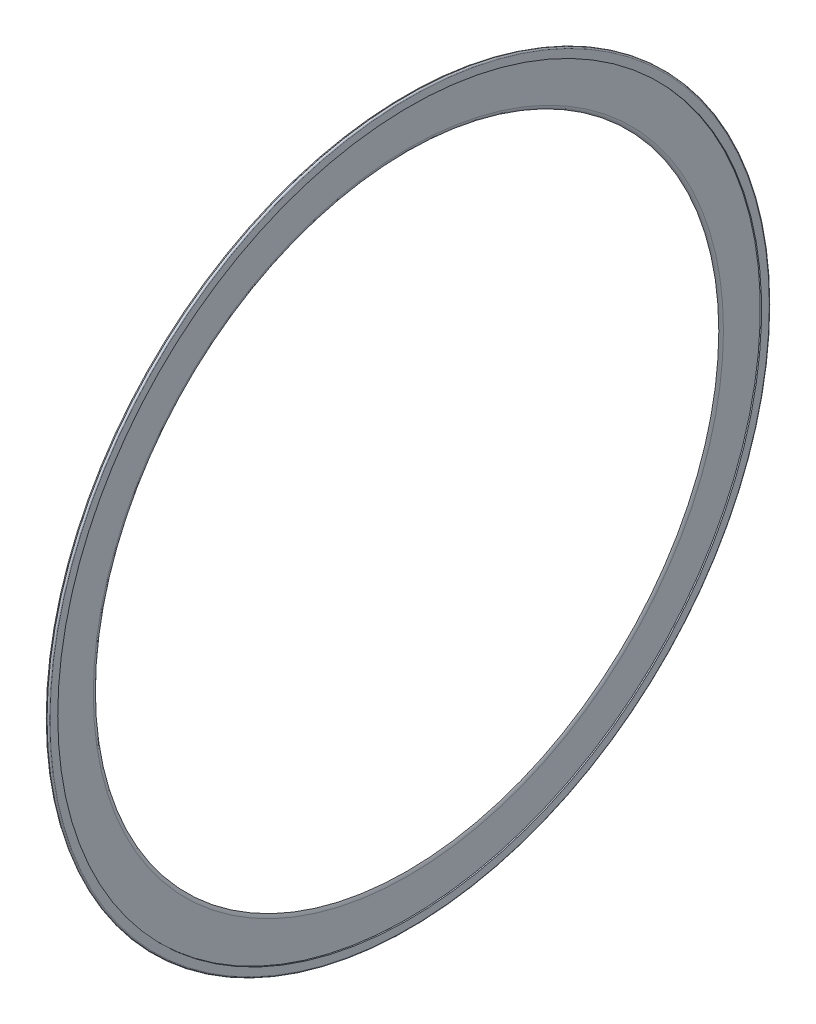
ISO-10303-21;
HEADER;
FILE_DESCRIPTION(('STEP AP214'),'2;1');
FILE_NAME('part.step','',(''),(''),'','','');
FILE_SCHEMA(('AUTOMOTIVE_DESIGN { 1 0 10303 214 1 1 1 1 }'));
ENDSEC;
DATA;
#1=APPLICATION_CONTEXT('core data for automotive mechanical design processes');
#2=APPLICATION_PROTOCOL_DEFINITION('international standard','automotive_design',2000,#1);
#3=PRODUCT_CONTEXT('',#1,'mechanical');
#4=PRODUCT('Part','Part','',(#3));
#5=PRODUCT_RELATED_PRODUCT_CATEGORY('part','',(#4));
#6=PRODUCT_DEFINITION_FORMATION('','',#4);
#7=PRODUCT_DEFINITION_CONTEXT('part definition',#1,'design');
#8=PRODUCT_DEFINITION('design','',#6,#7);
#9=PRODUCT_DEFINITION_SHAPE('','',#8);
#10=(LENGTH_UNIT() NAMED_UNIT(*) SI_UNIT(.MILLI.,.METRE.));
#11=(NAMED_UNIT(*) PLANE_ANGLE_UNIT() SI_UNIT($,.RADIAN.));
#12=(NAMED_UNIT(*) SI_UNIT($,.STERADIAN.) SOLID_ANGLE_UNIT());
#13=UNCERTAINTY_MEASURE_WITH_UNIT(LENGTH_MEASURE(1.E-05),#10,'distance_accuracy_value','');
#14=(GEOMETRIC_REPRESENTATION_CONTEXT(3) GLOBAL_UNCERTAINTY_ASSIGNED_CONTEXT((#13)) GLOBAL_UNIT_ASSIGNED_CONTEXT((#10,
#11,#12)) REPRESENTATION_CONTEXT('',''));
#15=CARTESIAN_POINT('',(0.,0.,0.));
#16=DIRECTION('',(0.,0.,1.));
#17=DIRECTION('',(1.,0.,0.));
#18=AXIS2_PLACEMENT_3D('',#15,#16,#17);
#19=CARTESIAN_POINT('',(0.35,0.,0.));
#20=DIRECTION('',(-1.,0.,0.));
#21=DIRECTION('',(0.,0.,1.));
#22=AXIS2_PLACEMENT_3D('',#19,#20,#21);
#23=TOROIDAL_SURFACE('',#22,30.8125,0.109375);
#24=CARTESIAN_POINT('',(0.240625,0.,0.));
#25=DIRECTION('',(-1.,0.,0.));
#26=DIRECTION('',(0.,0.,1.));
#27=AXIS2_PLACEMENT_3D('',#24,#25,#26);
#28=CIRCLE('',#27,30.8125);
#29=CARTESIAN_POINT('',(0.240625,0.,30.8125));
#30=VERTEX_POINT('',#29);
#31=EDGE_CURVE('E10',#30,#30,#28,.T.);
#32=ORIENTED_EDGE('',*,*,#31,.F.);
#33=EDGE_LOOP('',(#32));
#34=FACE_BOUND('',#33,.T.);
#35=CARTESIAN_POINT('',(0.459375,0.,0.));
#36=DIRECTION('',(-1.,0.,0.));
#37=DIRECTION('',(0.,0.,1.));
#38=AXIS2_PLACEMENT_3D('',#35,#36,#37);
#39=CIRCLE('',#38,30.8125);
#40=CARTESIAN_POINT('',(0.459375,0.,30.8125));
#41=VERTEX_POINT('',#40);
#42=EDGE_CURVE('E60',#41,#41,#39,.T.);
#43=ORIENTED_EDGE('',*,*,#42,.T.);
#44=EDGE_LOOP('',(#43));
#45=FACE_BOUND('',#44,.T.);
#46=ADVANCED_FACE('F14',(#34,#45),#23,.T.);
#47=CARTESIAN_POINT('',(0.35,0.,0.));
#48=DIRECTION('',(-1.,0.,0.));
#49=DIRECTION('',(0.,0.,1.));
#50=AXIS2_PLACEMENT_3D('',#47,#48,#49);
#51=CYLINDRICAL_SURFACE('',#50,30.8125);
#52=ORIENTED_EDGE('',*,*,#31,.T.);
#53=EDGE_LOOP('',(#52));
#54=FACE_BOUND('',#53,.T.);
#55=CARTESIAN_POINT('',(0.13125,0.,0.));
#56=DIRECTION('',(-1.,0.,0.));
#57=DIRECTION('',(0.,0.,1.));
#58=AXIS2_PLACEMENT_3D('',#55,#56,#57);
#59=CIRCLE('',#58,30.8125);
#60=CARTESIAN_POINT('',(0.13125,0.,30.8125));
#61=VERTEX_POINT('',#60);
#62=EDGE_CURVE('E21',#61,#61,#59,.T.);
#63=ORIENTED_EDGE('',*,*,#62,.F.);
#64=EDGE_LOOP('',(#63));
#65=FACE_BOUND('',#64,.T.);
#66=ADVANCED_FACE('F79',(#54,#65),#51,.T.);
#67=CARTESIAN_POINT('',(0.13125,30.8125,0.));
#68=DIRECTION('',(1.,0.,0.));
#69=DIRECTION('',(0.,0.,-1.));
#70=AXIS2_PLACEMENT_3D('',#67,#68,#69);
#71=PLANE('',#70);
#72=CARTESIAN_POINT('',(0.13125,0.,0.));
#73=DIRECTION('',(-1.,0.,0.));
#74=DIRECTION('',(0.,0.,1.));
#75=AXIS2_PLACEMENT_3D('',#72,#73,#74);
#76=CIRCLE('',#75,27.4375);
#77=CARTESIAN_POINT('',(0.13125,0.,27.4375));
#78=VERTEX_POINT('',#77);
#79=EDGE_CURVE('E30',#78,#78,#76,.T.);
#80=ORIENTED_EDGE('',*,*,#79,.F.);
#81=EDGE_LOOP('',(#80));
#82=FACE_BOUND('',#81,.T.);
#83=ORIENTED_EDGE('',*,*,#62,.T.);
#84=EDGE_LOOP('',(#83));
#85=FACE_BOUND('',#84,.T.);
#86=ADVANCED_FACE('F84',(#82,#85),#71,.F.);
#87=CARTESIAN_POINT('',(0.35,0.,0.));
#88=DIRECTION('',(-1.,0.,0.));
#89=DIRECTION('',(0.,0.,1.));
#90=AXIS2_PLACEMENT_3D('',#87,#88,#89);
#91=CYLINDRICAL_SURFACE('',#90,27.4375);
#92=CARTESIAN_POINT('',(0.240625,0.,0.));
#93=DIRECTION('',(-1.,0.,0.));
#94=DIRECTION('',(0.,0.,1.));
#95=AXIS2_PLACEMENT_3D('',#92,#93,#94);
#96=CIRCLE('',#95,27.4375);
#97=CARTESIAN_POINT('',(0.240625,0.,27.4375));
#98=VERTEX_POINT('',#97);
#99=EDGE_CURVE('E38',#98,#98,#96,.T.);
#100=ORIENTED_EDGE('',*,*,#99,.F.);
#101=EDGE_LOOP('',(#100));
#102=FACE_BOUND('',#101,.T.);
#103=ORIENTED_EDGE('',*,*,#79,.T.);
#104=EDGE_LOOP('',(#103));
#105=FACE_BOUND('',#104,.T.);
#106=ADVANCED_FACE('F88',(#102,#105),#91,.F.);
#107=CARTESIAN_POINT('',(0.240625,27.4375,0.));
#108=DIRECTION('',(1.,0.,0.));
#109=DIRECTION('',(0.,0.,-1.));
#110=AXIS2_PLACEMENT_3D('',#107,#108,#109);
#111=PLANE('',#110);
#112=CARTESIAN_POINT('',(0.240625,0.,0.));
#113=DIRECTION('',(-1.,0.,0.));
#114=DIRECTION('',(0.,0.,1.));
#115=AXIS2_PLACEMENT_3D('',#112,#113,#114);
#116=CIRCLE('',#115,26.7106209503523);
#117=CARTESIAN_POINT('',(0.240625,0.,26.7106209503523));
#118=VERTEX_POINT('',#117);
#119=EDGE_CURVE('E44',#118,#118,#116,.T.);
#120=ORIENTED_EDGE('',*,*,#119,.F.);
#121=EDGE_LOOP('',(#120));
#122=FACE_BOUND('',#121,.T.);
#123=ORIENTED_EDGE('',*,*,#99,.T.);
#124=EDGE_LOOP('',(#123));
#125=FACE_BOUND('',#124,.T.);
#126=ADVANCED_FACE('F95',(#122,#125),#111,.F.);
#127=CARTESIAN_POINT('',(-0.0875,0.,0.));
#128=DIRECTION('',(-1.,0.,0.));
#129=DIRECTION('',(0.,0.,1.));
#130=AXIS2_PLACEMENT_3D('',#127,#128,#129);
#131=TOROIDAL_SURFACE('',#130,27.,0.4375);
#132=CARTESIAN_POINT('',(0.35,0.,0.));
#133=DIRECTION('',(-1.,0.,0.));
#134=DIRECTION('',(0.,0.,1.));
#135=AXIS2_PLACEMENT_3D('',#132,#133,#134);
#136=CIRCLE('',#135,27.);
#137=CARTESIAN_POINT('',(0.35,0.,27.));
#138=VERTEX_POINT('',#137);
#139=EDGE_CURVE('E48',#138,#138,#136,.T.);
#140=ORIENTED_EDGE('',*,*,#139,.F.);
#141=EDGE_LOOP('',(#140));
#142=FACE_BOUND('',#141,.T.);
#143=ORIENTED_EDGE('',*,*,#119,.T.);
#144=EDGE_LOOP('',(#143));
#145=FACE_BOUND('',#144,.T.);
#146=ADVANCED_FACE('F99',(#142,#145),#131,.T.);
#147=CARTESIAN_POINT('',(0.35,27.,0.));
#148=DIRECTION('',(-1.,0.,0.));
#149=DIRECTION('',(0.,0.,1.));
#150=AXIS2_PLACEMENT_3D('',#147,#148,#149);
#151=PLANE('',#150);
#152=CARTESIAN_POINT('',(0.35,0.,0.));
#153=DIRECTION('',(-1.,0.,0.));
#154=DIRECTION('',(0.,0.,1.));
#155=AXIS2_PLACEMENT_3D('',#152,#153,#154);
#156=CIRCLE('',#155,30.15625);
#157=CARTESIAN_POINT('',(0.35,0.,30.15625));
#158=VERTEX_POINT('',#157);
#159=EDGE_CURVE('E52',#158,#158,#156,.T.);
#160=ORIENTED_EDGE('',*,*,#159,.F.);
#161=EDGE_LOOP('',(#160));
#162=FACE_BOUND('',#161,.T.);
#163=ORIENTED_EDGE('',*,*,#139,.T.);
#164=EDGE_LOOP('',(#163));
#165=FACE_BOUND('',#164,.T.);
#166=ADVANCED_FACE('F75',(#162,#165),#151,.F.);
#167=CARTESIAN_POINT('',(0.35,0.,0.));
#168=DIRECTION('',(-1.,0.,0.));
#169=DIRECTION('',(0.,0.,1.));
#170=AXIS2_PLACEMENT_3D('',#167,#168,#169);
#171=CYLINDRICAL_SURFACE('',#170,30.15625);
#172=CARTESIAN_POINT('',(0.459375,0.,0.));
#173=DIRECTION('',(-1.,0.,0.));
#174=DIRECTION('',(0.,0.,1.));
#175=AXIS2_PLACEMENT_3D('',#172,#173,#174);
#176=CIRCLE('',#175,30.15625);
#177=CARTESIAN_POINT('',(0.459375,0.,30.15625));
#178=VERTEX_POINT('',#177);
#179=EDGE_CURVE('E56',#178,#178,#176,.T.);
#180=ORIENTED_EDGE('',*,*,#179,.F.);
#181=EDGE_LOOP('',(#180));
#182=FACE_BOUND('',#181,.T.);
#183=ORIENTED_EDGE('',*,*,#159,.T.);
#184=EDGE_LOOP('',(#183));
#185=FACE_BOUND('',#184,.T.);
#186=ADVANCED_FACE('F68',(#182,#185),#171,.F.);
#187=CARTESIAN_POINT('',(0.459375,30.8125,0.));
#188=DIRECTION('',(1.,0.,0.));
#189=DIRECTION('',(0.,0.,-1.));
#190=AXIS2_PLACEMENT_3D('',#187,#188,#189);
#191=PLANE('',#190);
#192=ORIENTED_EDGE('',*,*,#179,.T.);
#193=EDGE_LOOP('',(#192));
#194=FACE_BOUND('',#193,.T.);
#195=ORIENTED_EDGE('',*,*,#42,.F.);
#196=EDGE_LOOP('',(#195));
#197=FACE_BOUND('',#196,.T.);
#198=ADVANCED_FACE('F66',(#194,#197),#191,.T.);
#199=CLOSED_SHELL('',(#46,#66,#86,#106,#126,#146,#166,#186,#198));
#200=MANIFOLD_SOLID_BREP('B1',#199);
#201=ADVANCED_BREP_SHAPE_REPRESENTATION('',(#18,#200),#14);
#202=SHAPE_DEFINITION_REPRESENTATION(#9,#201);
ENDSEC;
END-ISO-10303-21;
